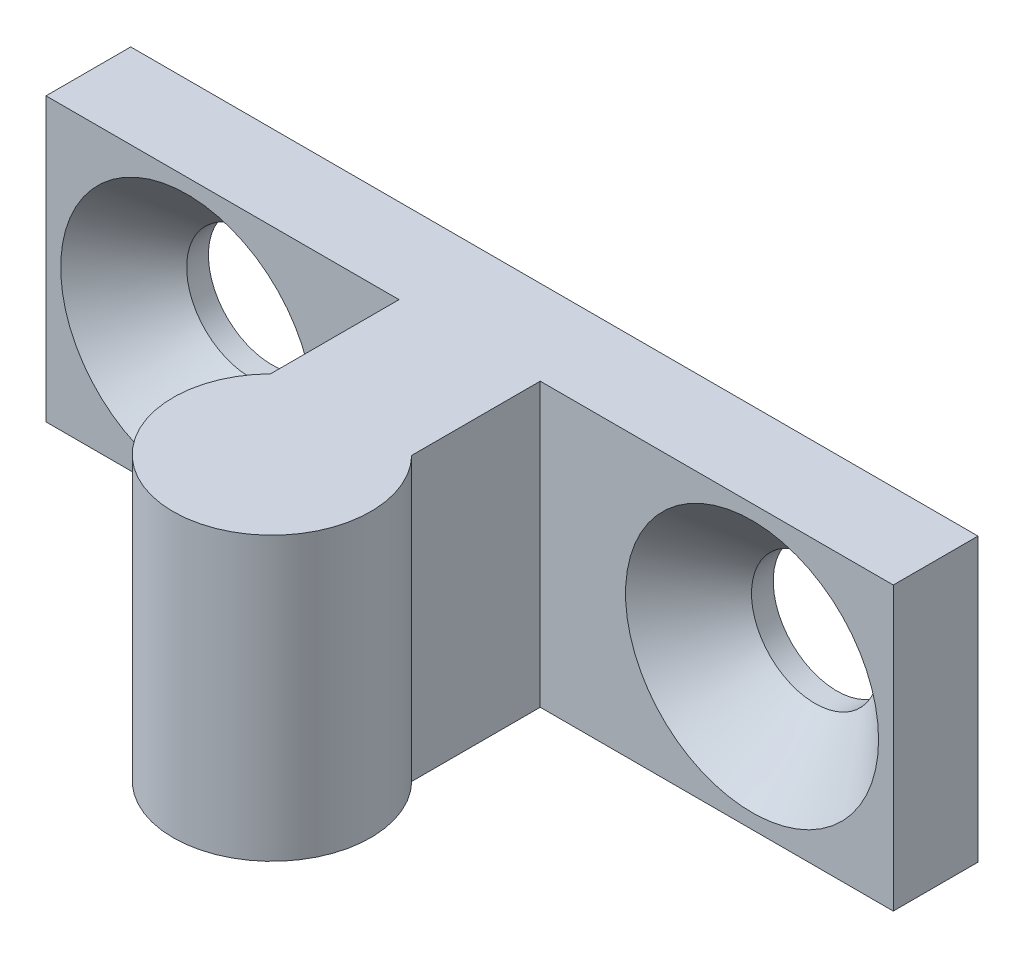
ISO-10303-21;
HEADER;
FILE_DESCRIPTION(('STEP AP214'),'2;1');
FILE_NAME('part.step','',(''),(''),'','','');
FILE_SCHEMA(('AUTOMOTIVE_DESIGN { 1 0 10303 214 1 1 1 1 }'));
ENDSEC;
DATA;
#1=APPLICATION_CONTEXT('core data for automotive mechanical design processes');
#2=APPLICATION_PROTOCOL_DEFINITION('international standard','automotive_design',2000,#1);
#3=PRODUCT_CONTEXT('',#1,'mechanical');
#4=PRODUCT('Part','Part','',(#3));
#5=PRODUCT_RELATED_PRODUCT_CATEGORY('part','',(#4));
#6=PRODUCT_DEFINITION_FORMATION('','',#4);
#7=PRODUCT_DEFINITION_CONTEXT('part definition',#1,'design');
#8=PRODUCT_DEFINITION('design','',#6,#7);
#9=PRODUCT_DEFINITION_SHAPE('','',#8);
#10=(LENGTH_UNIT() NAMED_UNIT(*) SI_UNIT(.MILLI.,.METRE.));
#11=(NAMED_UNIT(*) PLANE_ANGLE_UNIT() SI_UNIT($,.RADIAN.));
#12=(NAMED_UNIT(*) SI_UNIT($,.STERADIAN.) SOLID_ANGLE_UNIT());
#13=UNCERTAINTY_MEASURE_WITH_UNIT(LENGTH_MEASURE(1.E-05),#10,'distance_accuracy_value','');
#14=(GEOMETRIC_REPRESENTATION_CONTEXT(3) GLOBAL_UNCERTAINTY_ASSIGNED_CONTEXT((#13)) GLOBAL_UNIT_ASSIGNED_CONTEXT((#10,
#11,#12)) REPRESENTATION_CONTEXT('',''));
#15=CARTESIAN_POINT('',(0.,0.,0.));
#16=DIRECTION('',(0.,0.,1.));
#17=DIRECTION('',(1.,0.,0.));
#18=AXIS2_PLACEMENT_3D('',#15,#16,#17);
#19=CARTESIAN_POINT('',(-2.5,5.,1.5));
#20=DIRECTION('',(1.,0.,0.));
#21=DIRECTION('',(0.,0.,-1.));
#22=AXIS2_PLACEMENT_3D('',#19,#20,#21);
#23=PLANE('',#22);
#24=DIRECTION('',(0.,0.,1.));
#25=VECTOR('',#24,1.);
#26=CARTESIAN_POINT('',(-2.5,-5.,1.5));
#27=LINE('',#26,#25);
#28=CARTESIAN_POINT('',(-2.5,-5.,3.));
#29=VERTEX_POINT('',#28);
#30=CARTESIAN_POINT('',(-2.5,-5.,7.55051025721682));
#31=VERTEX_POINT('',#30);
#32=EDGE_CURVE('E129',#29,#31,#27,.T.);
#33=ORIENTED_EDGE('',*,*,#32,.T.);
#34=DIRECTION('',(0.,-1.,0.));
#35=VECTOR('',#34,1.);
#36=CARTESIAN_POINT('',(-2.5,5.,7.55051025721682));
#37=LINE('',#36,#35);
#38=CARTESIAN_POINT('',(-2.5,5.,7.55051025721682));
#39=VERTEX_POINT('',#38);
#40=EDGE_CURVE('E11',#39,#31,#37,.T.);
#41=ORIENTED_EDGE('',*,*,#40,.F.);
#42=DIRECTION('',(0.,0.,1.));
#43=VECTOR('',#42,1.);
#44=CARTESIAN_POINT('',(-2.5,5.,1.5));
#45=LINE('',#44,#43);
#46=CARTESIAN_POINT('',(-2.5,5.,3.));
#47=VERTEX_POINT('',#46);
#48=EDGE_CURVE('E172',#47,#39,#45,.T.);
#49=ORIENTED_EDGE('',*,*,#48,.F.);
#50=DIRECTION('',(0.,-1.,0.));
#51=VECTOR('',#50,1.);
#52=CARTESIAN_POINT('',(-2.5,5.,3.));
#53=LINE('',#52,#51);
#54=EDGE_CURVE('E147',#47,#29,#53,.T.);
#55=ORIENTED_EDGE('',*,*,#54,.T.);
#56=EDGE_LOOP('',(#33,#41,#49,#55));
#57=FACE_BOUND('',#56,.T.);
#58=ADVANCED_FACE('F34',(#57),#23,.F.);
#59=CARTESIAN_POINT('',(0.,5.,10.));
#60=DIRECTION('',(0.,-1.,0.));
#61=DIRECTION('',(0.,0.,-1.));
#62=AXIS2_PLACEMENT_3D('',#59,#60,#61);
#63=CYLINDRICAL_SURFACE('',#62,3.5);
#64=CARTESIAN_POINT('',(0.,-5.,10.));
#65=DIRECTION('',(0.,1.,0.));
#66=DIRECTION('',(0.,0.,1.));
#67=AXIS2_PLACEMENT_3D('',#64,#65,#66);
#68=CIRCLE('',#67,3.5);
#69=CARTESIAN_POINT('',(2.5,-5.,7.55051025721683));
#70=VERTEX_POINT('',#69);
#71=EDGE_CURVE('E132',#31,#70,#68,.T.);
#72=ORIENTED_EDGE('',*,*,#71,.T.);
#73=DIRECTION('',(0.,-1.,0.));
#74=VECTOR('',#73,1.);
#75=CARTESIAN_POINT('',(2.5,5.,7.55051025721683));
#76=LINE('',#75,#74);
#77=CARTESIAN_POINT('',(2.5,5.,7.55051025721683));
#78=VERTEX_POINT('',#77);
#79=EDGE_CURVE('E42',#78,#70,#76,.T.);
#80=ORIENTED_EDGE('',*,*,#79,.F.);
#81=CARTESIAN_POINT('',(0.,5.,10.));
#82=DIRECTION('',(0.,1.,0.));
#83=DIRECTION('',(0.,0.,1.));
#84=AXIS2_PLACEMENT_3D('',#81,#82,#83);
#85=CIRCLE('',#84,3.5);
#86=EDGE_CURVE('E92',#39,#78,#85,.T.);
#87=ORIENTED_EDGE('',*,*,#86,.F.);
#88=ORIENTED_EDGE('',*,*,#40,.T.);
#89=EDGE_LOOP('',(#72,#80,#87,#88));
#90=FACE_BOUND('',#89,.T.);
#91=ADVANCED_FACE('F160',(#90),#63,.T.);
#92=CARTESIAN_POINT('',(2.5,5.,1.5));
#93=DIRECTION('',(1.,0.,0.));
#94=DIRECTION('',(0.,0.,-1.));
#95=AXIS2_PLACEMENT_3D('',#92,#93,#94);
#96=PLANE('',#95);
#97=DIRECTION('',(0.,0.,1.));
#98=VECTOR('',#97,1.);
#99=CARTESIAN_POINT('',(2.5,-5.,1.5));
#100=LINE('',#99,#98);
#101=CARTESIAN_POINT('',(2.5,-5.,3.));
#102=VERTEX_POINT('',#101);
#103=EDGE_CURVE('E136',#102,#70,#100,.T.);
#104=ORIENTED_EDGE('',*,*,#103,.F.);
#105=DIRECTION('',(0.,-1.,0.));
#106=VECTOR('',#105,1.);
#107=CARTESIAN_POINT('',(2.5,5.,3.));
#108=LINE('',#107,#106);
#109=CARTESIAN_POINT('',(2.5,5.,3.));
#110=VERTEX_POINT('',#109);
#111=EDGE_CURVE('E153',#110,#102,#108,.T.);
#112=ORIENTED_EDGE('',*,*,#111,.F.);
#113=DIRECTION('',(0.,0.,1.));
#114=VECTOR('',#113,1.);
#115=CARTESIAN_POINT('',(2.5,5.,1.5));
#116=LINE('',#115,#114);
#117=EDGE_CURVE('E159',#110,#78,#116,.T.);
#118=ORIENTED_EDGE('',*,*,#117,.T.);
#119=ORIENTED_EDGE('',*,*,#79,.T.);
#120=EDGE_LOOP('',(#104,#112,#118,#119));
#121=FACE_BOUND('',#120,.T.);
#122=ADVANCED_FACE('F157',(#121),#96,.T.);
#123=CARTESIAN_POINT('',(-23.5923275220979,5.,3.));
#124=DIRECTION('',(0.,0.,-1.));
#125=DIRECTION('',(-1.,0.,0.));
#126=AXIS2_PLACEMENT_3D('',#123,#124,#125);
#127=PLANE('',#126);
#128=CARTESIAN_POINT('',(10.,0.,3.));
#129=DIRECTION('',(0.,0.,1.));
#130=DIRECTION('',(1.,0.,0.));
#131=AXIS2_PLACEMENT_3D('',#128,#129,#130);
#132=CIRCLE('',#131,4.48);
#133=CARTESIAN_POINT('',(14.48,0.,3.));
#134=VERTEX_POINT('',#133);
#135=EDGE_CURVE('E181',#134,#134,#132,.T.);
#136=ORIENTED_EDGE('',*,*,#135,.F.);
#137=EDGE_LOOP('',(#136));
#138=FACE_BOUND('',#137,.T.);
#139=DIRECTION('',(1.,0.,0.));
#140=VECTOR('',#139,1.);
#141=CARTESIAN_POINT('',(-23.5923275220979,-5.,3.));
#142=LINE('',#141,#140);
#143=CARTESIAN_POINT('',(15.,-5.,2.99999999999999));
#144=VERTEX_POINT('',#143);
#145=EDGE_CURVE('E139',#102,#144,#142,.T.);
#146=ORIENTED_EDGE('',*,*,#145,.T.);
#147=DIRECTION('',(0.,-1.,0.));
#148=VECTOR('',#147,1.);
#149=CARTESIAN_POINT('',(15.,5.,2.99999999999999));
#150=LINE('',#149,#148);
#151=CARTESIAN_POINT('',(15.,5.,2.99999999999999));
#152=VERTEX_POINT('',#151);
#153=EDGE_CURVE('E151',#152,#144,#150,.T.);
#154=ORIENTED_EDGE('',*,*,#153,.F.);
#155=DIRECTION('',(1.,0.,0.));
#156=VECTOR('',#155,1.);
#157=CARTESIAN_POINT('',(-23.5923275220979,5.,3.));
#158=LINE('',#157,#156);
#159=EDGE_CURVE('E125',#110,#152,#158,.T.);
#160=ORIENTED_EDGE('',*,*,#159,.F.);
#161=ORIENTED_EDGE('',*,*,#111,.T.);
#162=EDGE_LOOP('',(#146,#154,#160,#161));
#163=FACE_BOUND('',#162,.T.);
#164=ADVANCED_FACE('F169',(#138,#163),#127,.F.);
#165=CARTESIAN_POINT('',(15.,5.,1.5));
#166=DIRECTION('',(1.,0.,0.));
#167=DIRECTION('',(0.,0.,-1.));
#168=AXIS2_PLACEMENT_3D('',#165,#166,#167);
#169=PLANE('',#168);
#170=DIRECTION('',(0.,0.,1.));
#171=VECTOR('',#170,1.);
#172=CARTESIAN_POINT('',(15.,-5.,1.5));
#173=LINE('',#172,#171);
#174=CARTESIAN_POINT('',(15.,-5.,0.));
#175=VERTEX_POINT('',#174);
#176=EDGE_CURVE('E142',#175,#144,#173,.T.);
#177=ORIENTED_EDGE('',*,*,#176,.F.);
#178=DIRECTION('',(0.,-1.,0.));
#179=VECTOR('',#178,1.);
#180=CARTESIAN_POINT('',(15.,5.,0.));
#181=LINE('',#180,#179);
#182=CARTESIAN_POINT('',(15.,5.,0.));
#183=VERTEX_POINT('',#182);
#184=EDGE_CURVE('E114',#183,#175,#181,.T.);
#185=ORIENTED_EDGE('',*,*,#184,.F.);
#186=DIRECTION('',(0.,0.,1.));
#187=VECTOR('',#186,1.);
#188=CARTESIAN_POINT('',(15.,5.,1.5));
#189=LINE('',#188,#187);
#190=EDGE_CURVE('E123',#183,#152,#189,.T.);
#191=ORIENTED_EDGE('',*,*,#190,.T.);
#192=ORIENTED_EDGE('',*,*,#153,.T.);
#193=EDGE_LOOP('',(#177,#185,#191,#192));
#194=FACE_BOUND('',#193,.T.);
#195=ADVANCED_FACE('F207',(#194),#169,.T.);
#196=CARTESIAN_POINT('',(-23.5923275220979,5.,0.));
#197=DIRECTION('',(0.,0.,-1.));
#198=DIRECTION('',(-1.,0.,0.));
#199=AXIS2_PLACEMENT_3D('',#196,#197,#198);
#200=PLANE('',#199);
#201=CARTESIAN_POINT('',(-10.,0.,0.));
#202=DIRECTION('',(0.,0.,1.));
#203=DIRECTION('',(1.,0.,0.));
#204=AXIS2_PLACEMENT_3D('',#201,#202,#203);
#205=CIRCLE('',#204,2.25);
#206=CARTESIAN_POINT('',(-7.75,0.,0.));
#207=VERTEX_POINT('',#206);
#208=EDGE_CURVE('E184',#207,#207,#205,.T.);
#209=ORIENTED_EDGE('',*,*,#208,.T.);
#210=EDGE_LOOP('',(#209));
#211=FACE_BOUND('',#210,.T.);
#212=CARTESIAN_POINT('',(10.,0.,0.));
#213=DIRECTION('',(0.,0.,1.));
#214=DIRECTION('',(1.,0.,0.));
#215=AXIS2_PLACEMENT_3D('',#212,#213,#214);
#216=CIRCLE('',#215,2.25);
#217=CARTESIAN_POINT('',(12.25,0.,0.));
#218=VERTEX_POINT('',#217);
#219=EDGE_CURVE('E133',#218,#218,#216,.T.);
#220=ORIENTED_EDGE('',*,*,#219,.T.);
#221=EDGE_LOOP('',(#220));
#222=FACE_BOUND('',#221,.T.);
#223=DIRECTION('',(1.,0.,0.));
#224=VECTOR('',#223,1.);
#225=CARTESIAN_POINT('',(-23.5923275220979,-5.,0.));
#226=LINE('',#225,#224);
#227=CARTESIAN_POINT('',(-15.,-5.,0.));
#228=VERTEX_POINT('',#227);
#229=EDGE_CURVE('E113',#228,#175,#226,.T.);
#230=ORIENTED_EDGE('',*,*,#229,.F.);
#231=DIRECTION('',(0.,-1.,0.));
#232=VECTOR('',#231,1.);
#233=CARTESIAN_POINT('',(-15.,5.,0.));
#234=LINE('',#233,#232);
#235=CARTESIAN_POINT('',(-15.,5.,0.));
#236=VERTEX_POINT('',#235);
#237=EDGE_CURVE('E107',#236,#228,#234,.T.);
#238=ORIENTED_EDGE('',*,*,#237,.F.);
#239=DIRECTION('',(1.,0.,0.));
#240=VECTOR('',#239,1.);
#241=CARTESIAN_POINT('',(-23.5923275220979,5.,0.));
#242=LINE('',#241,#240);
#243=EDGE_CURVE('E111',#236,#183,#242,.T.);
#244=ORIENTED_EDGE('',*,*,#243,.T.);
#245=ORIENTED_EDGE('',*,*,#184,.T.);
#246=EDGE_LOOP('',(#230,#238,#244,#245));
#247=FACE_BOUND('',#246,.T.);
#248=ADVANCED_FACE('F109',(#211,#222,#247),#200,.T.);
#249=CARTESIAN_POINT('',(-15.,5.,1.5));
#250=DIRECTION('',(1.,0.,0.));
#251=DIRECTION('',(0.,0.,-1.));
#252=AXIS2_PLACEMENT_3D('',#249,#250,#251);
#253=PLANE('',#252);
#254=DIRECTION('',(0.,0.,1.));
#255=VECTOR('',#254,1.);
#256=CARTESIAN_POINT('',(-15.,-5.,1.5));
#257=LINE('',#256,#255);
#258=CARTESIAN_POINT('',(-15.,-5.,3.));
#259=VERTEX_POINT('',#258);
#260=EDGE_CURVE('E78',#228,#259,#257,.T.);
#261=ORIENTED_EDGE('',*,*,#260,.T.);
#262=DIRECTION('',(0.,-1.,0.));
#263=VECTOR('',#262,1.);
#264=CARTESIAN_POINT('',(-15.,5.,3.));
#265=LINE('',#264,#263);
#266=CARTESIAN_POINT('',(-15.,5.,3.));
#267=VERTEX_POINT('',#266);
#268=EDGE_CURVE('E115',#267,#259,#265,.T.);
#269=ORIENTED_EDGE('',*,*,#268,.F.);
#270=DIRECTION('',(0.,0.,1.));
#271=VECTOR('',#270,1.);
#272=CARTESIAN_POINT('',(-15.,5.,1.5));
#273=LINE('',#272,#271);
#274=EDGE_CURVE('E117',#236,#267,#273,.T.);
#275=ORIENTED_EDGE('',*,*,#274,.F.);
#276=ORIENTED_EDGE('',*,*,#237,.T.);
#277=EDGE_LOOP('',(#261,#269,#275,#276));
#278=FACE_BOUND('',#277,.T.);
#279=ADVANCED_FACE('F118',(#278),#253,.F.);
#280=CARTESIAN_POINT('',(-10.,0.,3.));
#281=DIRECTION('',(0.,0.,1.));
#282=DIRECTION('',(1.,0.,0.));
#283=AXIS2_PLACEMENT_3D('',#280,#281,#282);
#284=CIRCLE('',#283,4.48);
#285=CARTESIAN_POINT('',(-5.52,0.,3.));
#286=VERTEX_POINT('',#285);
#287=EDGE_CURVE('E190',#286,#286,#284,.T.);
#288=ORIENTED_EDGE('',*,*,#287,.F.);
#289=EDGE_LOOP('',(#288));
#290=FACE_BOUND('',#289,.T.);
#291=EDGE_CURVE('E84',#259,#29,#142,.T.);
#292=ORIENTED_EDGE('',*,*,#291,.T.);
#293=ORIENTED_EDGE('',*,*,#54,.F.);
#294=EDGE_CURVE('E50',#267,#47,#158,.T.);
#295=ORIENTED_EDGE('',*,*,#294,.F.);
#296=ORIENTED_EDGE('',*,*,#268,.T.);
#297=EDGE_LOOP('',(#292,#293,#295,#296));
#298=FACE_BOUND('',#297,.T.);
#299=ADVANCED_FACE('F196',(#290,#298),#127,.F.);
#300=CARTESIAN_POINT('',(-23.5923275220979,5.,1.5));
#301=DIRECTION('',(0.,1.,0.));
#302=DIRECTION('',(0.,0.,1.));
#303=AXIS2_PLACEMENT_3D('',#300,#301,#302);
#304=PLANE('',#303);
#305=ORIENTED_EDGE('',*,*,#48,.T.);
#306=ORIENTED_EDGE('',*,*,#86,.T.);
#307=ORIENTED_EDGE('',*,*,#117,.F.);
#308=ORIENTED_EDGE('',*,*,#159,.T.);
#309=ORIENTED_EDGE('',*,*,#190,.F.);
#310=ORIENTED_EDGE('',*,*,#243,.F.);
#311=ORIENTED_EDGE('',*,*,#274,.T.);
#312=ORIENTED_EDGE('',*,*,#294,.T.);
#313=EDGE_LOOP('',(#305,#306,#307,#308,#309,#310,#311,#312));
#314=FACE_BOUND('',#313,.T.);
#315=ADVANCED_FACE('F121',(#314),#304,.T.);
#316=CARTESIAN_POINT('',(-23.5923275220979,-5.,1.5));
#317=DIRECTION('',(0.,1.,0.));
#318=DIRECTION('',(0.,0.,1.));
#319=AXIS2_PLACEMENT_3D('',#316,#317,#318);
#320=PLANE('',#319);
#321=ORIENTED_EDGE('',*,*,#32,.F.);
#322=ORIENTED_EDGE('',*,*,#291,.F.);
#323=ORIENTED_EDGE('',*,*,#260,.F.);
#324=ORIENTED_EDGE('',*,*,#229,.T.);
#325=ORIENTED_EDGE('',*,*,#176,.T.);
#326=ORIENTED_EDGE('',*,*,#145,.F.);
#327=ORIENTED_EDGE('',*,*,#103,.T.);
#328=ORIENTED_EDGE('',*,*,#71,.F.);
#329=EDGE_LOOP('',(#321,#322,#323,#324,#325,#326,#327,#328));
#330=FACE_BOUND('',#329,.T.);
#331=ADVANCED_FACE('F165',(#330),#320,.F.);
#332=CARTESIAN_POINT('',(10.,0.,3.));
#333=DIRECTION('',(0.,0.,1.));
#334=DIRECTION('',(1.,0.,0.));
#335=AXIS2_PLACEMENT_3D('',#332,#333,#334);
#336=CYLINDRICAL_SURFACE('',#335,2.24999999999999);
#337=ORIENTED_EDGE('',*,*,#219,.F.);
#338=EDGE_LOOP('',(#337));
#339=FACE_BOUND('',#338,.T.);
#340=CARTESIAN_POINT('',(10.,0.,0.769999999999988));
#341=DIRECTION('',(0.,0.,1.));
#342=DIRECTION('',(1.,0.,0.));
#343=AXIS2_PLACEMENT_3D('',#340,#341,#342);
#344=CIRCLE('',#343,2.24999999999999);
#345=CARTESIAN_POINT('',(12.25,0.,0.769999999999988));
#346=VERTEX_POINT('',#345);
#347=EDGE_CURVE('E178',#346,#346,#344,.T.);
#348=ORIENTED_EDGE('',*,*,#347,.T.);
#349=EDGE_LOOP('',(#348));
#350=FACE_BOUND('',#349,.T.);
#351=ADVANCED_FACE('F231',(#339,#350),#336,.F.);
#352=CARTESIAN_POINT('',(10.,0.,3.));
#353=DIRECTION('',(0.,0.,1.));
#354=DIRECTION('',(1.,0.,0.));
#355=AXIS2_PLACEMENT_3D('',#352,#353,#354);
#356=CONICAL_SURFACE('',#355,4.48,0.785398163397449);
#357=ORIENTED_EDGE('',*,*,#347,.F.);
#358=EDGE_LOOP('',(#357));
#359=FACE_BOUND('',#358,.T.);
#360=ORIENTED_EDGE('',*,*,#135,.T.);
#361=EDGE_LOOP('',(#360));
#362=FACE_BOUND('',#361,.T.);
#363=ADVANCED_FACE('F234',(#359,#362),#356,.F.);
#364=CARTESIAN_POINT('',(-10.,0.,3.));
#365=DIRECTION('',(0.,0.,1.));
#366=DIRECTION('',(1.,0.,0.));
#367=AXIS2_PLACEMENT_3D('',#364,#365,#366);
#368=CYLINDRICAL_SURFACE('',#367,2.24999999999999);
#369=ORIENTED_EDGE('',*,*,#208,.F.);
#370=EDGE_LOOP('',(#369));
#371=FACE_BOUND('',#370,.T.);
#372=CARTESIAN_POINT('',(-10.,0.,0.769999999999988));
#373=DIRECTION('',(0.,0.,1.));
#374=DIRECTION('',(1.,0.,0.));
#375=AXIS2_PLACEMENT_3D('',#372,#373,#374);
#376=CIRCLE('',#375,2.24999999999999);
#377=CARTESIAN_POINT('',(-7.75000000000001,0.,0.769999999999988));
#378=VERTEX_POINT('',#377);
#379=EDGE_CURVE('E187',#378,#378,#376,.T.);
#380=ORIENTED_EDGE('',*,*,#379,.T.);
#381=EDGE_LOOP('',(#380));
#382=FACE_BOUND('',#381,.T.);
#383=ADVANCED_FACE('F240',(#371,#382),#368,.F.);
#384=CARTESIAN_POINT('',(-10.,0.,3.));
#385=DIRECTION('',(0.,0.,1.));
#386=DIRECTION('',(1.,0.,0.));
#387=AXIS2_PLACEMENT_3D('',#384,#385,#386);
#388=CONICAL_SURFACE('',#387,4.48,0.785398163397449);
#389=ORIENTED_EDGE('',*,*,#379,.F.);
#390=EDGE_LOOP('',(#389));
#391=FACE_BOUND('',#390,.T.);
#392=ORIENTED_EDGE('',*,*,#287,.T.);
#393=EDGE_LOOP('',(#392));
#394=FACE_BOUND('',#393,.T.);
#395=ADVANCED_FACE('F194',(#391,#394),#388,.F.);
#396=CLOSED_SHELL('',(#58,#91,#122,#164,#195,#248,#279,#299,#315,#331,#351,#363,#383,#395));
#397=MANIFOLD_SOLID_BREP('B2',#396);
#398=ADVANCED_BREP_SHAPE_REPRESENTATION('',(#18,#397),#14);
#399=SHAPE_DEFINITION_REPRESENTATION(#9,#398);
ENDSEC;
END-ISO-10303-21;
